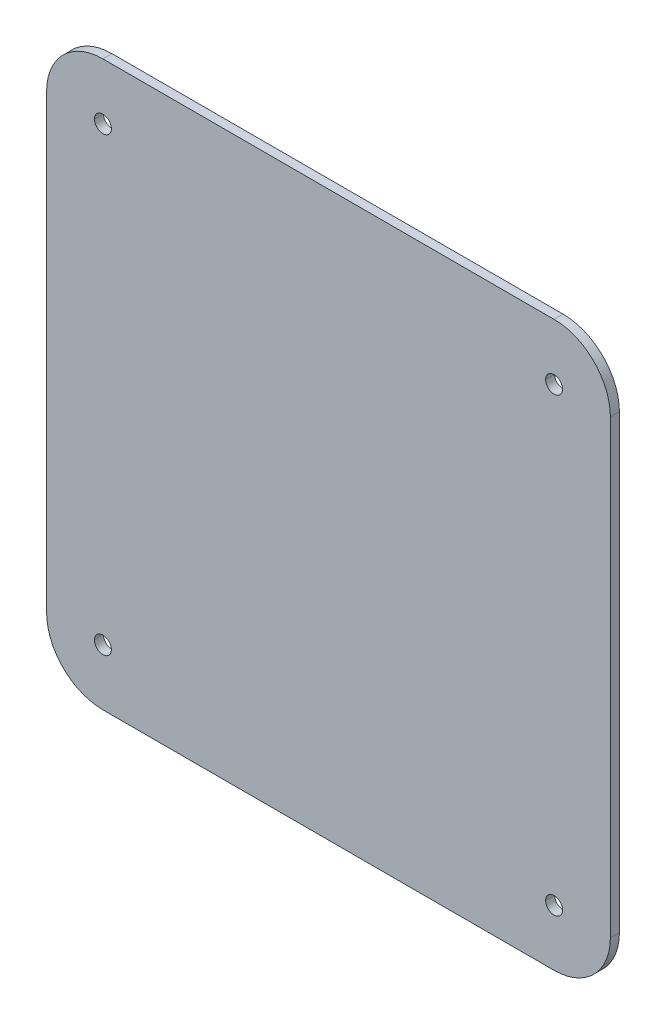
ISO-10303-21;
HEADER;
FILE_DESCRIPTION(('STEP AP214'),'2;1');
FILE_NAME('part.step','',(''),(''),'','','');
FILE_SCHEMA(('AUTOMOTIVE_DESIGN { 1 0 10303 214 1 1 1 1 }'));
ENDSEC;
DATA;
#1=APPLICATION_CONTEXT('core data for automotive mechanical design processes');
#2=APPLICATION_PROTOCOL_DEFINITION('international standard','automotive_design',2000,#1);
#3=PRODUCT_CONTEXT('',#1,'mechanical');
#4=PRODUCT('Part','Part','',(#3));
#5=PRODUCT_RELATED_PRODUCT_CATEGORY('part','',(#4));
#6=PRODUCT_DEFINITION_FORMATION('','',#4);
#7=PRODUCT_DEFINITION_CONTEXT('part definition',#1,'design');
#8=PRODUCT_DEFINITION('design','',#6,#7);
#9=PRODUCT_DEFINITION_SHAPE('','',#8);
#10=(LENGTH_UNIT() NAMED_UNIT(*) SI_UNIT(.MILLI.,.METRE.));
#11=(NAMED_UNIT(*) PLANE_ANGLE_UNIT() SI_UNIT($,.RADIAN.));
#12=(NAMED_UNIT(*) SI_UNIT($,.STERADIAN.) SOLID_ANGLE_UNIT());
#13=UNCERTAINTY_MEASURE_WITH_UNIT(LENGTH_MEASURE(1.E-05),#10,'distance_accuracy_value','');
#14=(GEOMETRIC_REPRESENTATION_CONTEXT(3) GLOBAL_UNCERTAINTY_ASSIGNED_CONTEXT((#13)) GLOBAL_UNIT_ASSIGNED_CONTEXT((#10,
#11,#12)) REPRESENTATION_CONTEXT('',''));
#15=CARTESIAN_POINT('',(0.,0.,0.));
#16=DIRECTION('',(0.,0.,1.));
#17=DIRECTION('',(1.,0.,0.));
#18=AXIS2_PLACEMENT_3D('',#15,#16,#17);
#19=CARTESIAN_POINT('',(11.430022860046,11.694183388367,0.));
#20=DIRECTION('',(0.,0.,-1.));
#21=DIRECTION('',(0.,-1.,0.));
#22=AXIS2_PLACEMENT_3D('',#19,#20,#21);
#23=CYLINDRICAL_SURFACE('',#22,9.9872999746);
#24=DIRECTION('',(0.,0.,1.));
#25=VECTOR('',#24,1.);
#26=CARTESIAN_POINT('',(11.430022860046,1.706883413767,0.));
#27=LINE('',#26,#25);
#28=CARTESIAN_POINT('',(11.430022860046,1.706883413767,0.));
#29=VERTEX_POINT('',#28);
#30=CARTESIAN_POINT('',(11.430022860046,1.706883413767,1.600050800102));
#31=VERTEX_POINT('',#30);
#32=EDGE_CURVE('E9',#29,#31,#27,.T.);
#33=ORIENTED_EDGE('',*,*,#32,.T.);
#34=CARTESIAN_POINT('',(11.430022860046,11.694183388367,1.600050800102));
#35=DIRECTION('',(0.,0.,-1.));
#36=DIRECTION('',(0.,-1.,0.));
#37=AXIS2_PLACEMENT_3D('',#34,#35,#36);
#38=CIRCLE('',#37,9.9872999746);
#39=CARTESIAN_POINT('',(1.442722885446,11.694183388367,1.600050800102));
#40=VERTEX_POINT('',#39);
#41=EDGE_CURVE('E194',#31,#40,#38,.T.);
#42=ORIENTED_EDGE('',*,*,#41,.T.);
#43=DIRECTION('',(0.,0.,1.));
#44=VECTOR('',#43,1.);
#45=CARTESIAN_POINT('',(1.442722885446,11.694183388367,0.));
#46=LINE('',#45,#44);
#47=CARTESIAN_POINT('',(1.442722885446,11.694183388367,0.));
#48=VERTEX_POINT('',#47);
#49=EDGE_CURVE('E18',#48,#40,#46,.T.);
#50=ORIENTED_EDGE('',*,*,#49,.F.);
#51=CARTESIAN_POINT('',(11.430022860046,11.694183388367,0.));
#52=DIRECTION('',(0.,0.,-1.));
#53=DIRECTION('',(0.,-1.,0.));
#54=AXIS2_PLACEMENT_3D('',#51,#52,#53);
#55=CIRCLE('',#54,9.9872999746);
#56=EDGE_CURVE('E204',#29,#48,#55,.T.);
#57=ORIENTED_EDGE('',*,*,#56,.F.);
#58=EDGE_LOOP('',(#33,#42,#50,#57));
#59=FACE_BOUND('',#58,.T.);
#60=ADVANCED_FACE('F14',(#59),#23,.T.);
#61=CARTESIAN_POINT('',(91.430022860046,1.706883413767,0.));
#62=DIRECTION('',(0.,-1.,0.));
#63=DIRECTION('',(0.,0.,-1.));
#64=AXIS2_PLACEMENT_3D('',#61,#62,#63);
#65=PLANE('',#64);
#66=DIRECTION('',(0.,0.,1.));
#67=VECTOR('',#66,1.);
#68=CARTESIAN_POINT('',(91.430022860046,1.706883413767,0.));
#69=LINE('',#68,#67);
#70=CARTESIAN_POINT('',(91.430022860046,1.706883413767,0.));
#71=VERTEX_POINT('',#70);
#72=CARTESIAN_POINT('',(91.430022860046,1.706883413767,1.600050800102));
#73=VERTEX_POINT('',#72);
#74=EDGE_CURVE('E205',#71,#73,#69,.T.);
#75=ORIENTED_EDGE('',*,*,#74,.T.);
#76=DIRECTION('',(-1.,0.,0.));
#77=VECTOR('',#76,1.);
#78=CARTESIAN_POINT('',(91.430022860046,1.706883413767,1.600050800102));
#79=LINE('',#78,#77);
#80=EDGE_CURVE('E195',#73,#31,#79,.T.);
#81=ORIENTED_EDGE('',*,*,#80,.T.);
#82=ORIENTED_EDGE('',*,*,#32,.F.);
#83=DIRECTION('',(-1.,0.,0.));
#84=VECTOR('',#83,1.);
#85=CARTESIAN_POINT('',(91.430022860046,1.706883413767,0.));
#86=LINE('',#85,#84);
#87=EDGE_CURVE('E223',#71,#29,#86,.T.);
#88=ORIENTED_EDGE('',*,*,#87,.F.);
#89=EDGE_LOOP('',(#75,#81,#82,#88));
#90=FACE_BOUND('',#89,.T.);
#91=ADVANCED_FACE('F515',(#90),#65,.T.);
#92=CARTESIAN_POINT('',(1.442722885446,11.694183388367,0.));
#93=DIRECTION('',(-1.,0.,0.));
#94=DIRECTION('',(0.,1.,0.));
#95=AXIS2_PLACEMENT_3D('',#92,#93,#94);
#96=PLANE('',#95);
#97=ORIENTED_EDGE('',*,*,#49,.T.);
#98=DIRECTION('',(0.,1.,0.));
#99=VECTOR('',#98,1.);
#100=CARTESIAN_POINT('',(1.442722885446,11.694183388367,1.600050800102));
#101=LINE('',#100,#99);
#102=CARTESIAN_POINT('',(1.442722885446,91.694183388367,1.600050800102));
#103=VERTEX_POINT('',#102);
#104=EDGE_CURVE('E191',#40,#103,#101,.T.);
#105=ORIENTED_EDGE('',*,*,#104,.T.);
#106=DIRECTION('',(0.,0.,1.));
#107=VECTOR('',#106,1.);
#108=CARTESIAN_POINT('',(1.442722885446,91.694183388367,0.));
#109=LINE('',#108,#107);
#110=CARTESIAN_POINT('',(1.442722885446,91.694183388367,0.));
#111=VERTEX_POINT('',#110);
#112=EDGE_CURVE('E245',#111,#103,#109,.T.);
#113=ORIENTED_EDGE('',*,*,#112,.F.);
#114=DIRECTION('',(0.,1.,0.));
#115=VECTOR('',#114,1.);
#116=CARTESIAN_POINT('',(1.442722885446,11.694183388367,0.));
#117=LINE('',#116,#115);
#118=EDGE_CURVE('E221',#48,#111,#117,.T.);
#119=ORIENTED_EDGE('',*,*,#118,.F.);
#120=EDGE_LOOP('',(#97,#105,#113,#119));
#121=FACE_BOUND('',#120,.T.);
#122=ADVANCED_FACE('F316',(#121),#96,.T.);
#123=CARTESIAN_POINT('',(51.430022860046,51.694183388367,0.));
#124=DIRECTION('',(0.,0.,-1.));
#125=DIRECTION('',(0.,-1.,0.));
#126=AXIS2_PLACEMENT_3D('',#123,#124,#125);
#127=PLANE('',#126);
#128=CARTESIAN_POINT('',(91.430022860046,11.694183388367,0.));
#129=DIRECTION('',(0.,0.,1.));
#130=DIRECTION('',(1.,0.,0.));
#131=AXIS2_PLACEMENT_3D('',#128,#129,#130);
#132=CIRCLE('',#131,1.5);
#133=CARTESIAN_POINT('',(92.930022860046,11.694183388367,0.));
#134=VERTEX_POINT('',#133);
#135=CARTESIAN_POINT('',(89.930022860046,11.694183388367,0.));
#136=VERTEX_POINT('',#135);
#137=EDGE_CURVE('E214',#134,#136,#132,.T.);
#138=ORIENTED_EDGE('',*,*,#137,.T.);
#139=CARTESIAN_POINT('',(91.430022860046,11.694183388367,0.));
#140=DIRECTION('',(0.,0.,1.));
#141=DIRECTION('',(1.,0.,0.));
#142=AXIS2_PLACEMENT_3D('',#139,#140,#141);
#143=CIRCLE('',#142,1.5);
#144=EDGE_CURVE('E237',#136,#134,#143,.T.);
#145=ORIENTED_EDGE('',*,*,#144,.T.);
#146=EDGE_LOOP('',(#138,#145));
#147=FACE_BOUND('',#146,.T.);
#148=CARTESIAN_POINT('',(11.430022860046,11.694183388367,0.));
#149=DIRECTION('',(0.,0.,1.));
#150=DIRECTION('',(1.,0.,0.));
#151=AXIS2_PLACEMENT_3D('',#148,#149,#150);
#152=CIRCLE('',#151,1.5);
#153=CARTESIAN_POINT('',(12.930022860046,11.694183388367,0.));
#154=VERTEX_POINT('',#153);
#155=CARTESIAN_POINT('',(9.930022860046,11.694183388367,0.));
#156=VERTEX_POINT('',#155);
#157=EDGE_CURVE('E190',#154,#156,#152,.T.);
#158=ORIENTED_EDGE('',*,*,#157,.T.);
#159=CARTESIAN_POINT('',(11.430022860046,11.694183388367,0.));
#160=DIRECTION('',(0.,0.,1.));
#161=DIRECTION('',(1.,0.,0.));
#162=AXIS2_PLACEMENT_3D('',#159,#160,#161);
#163=CIRCLE('',#162,1.5);
#164=EDGE_CURVE('E196',#156,#154,#163,.T.);
#165=ORIENTED_EDGE('',*,*,#164,.T.);
#166=EDGE_LOOP('',(#158,#165));
#167=FACE_BOUND('',#166,.T.);
#168=CARTESIAN_POINT('',(91.430022860046,91.694183388367,0.));
#169=DIRECTION('',(0.,0.,1.));
#170=DIRECTION('',(1.,0.,0.));
#171=AXIS2_PLACEMENT_3D('',#168,#169,#170);
#172=CIRCLE('',#171,1.5);
#173=CARTESIAN_POINT('',(92.930022860046,91.694183388367,0.));
#174=VERTEX_POINT('',#173);
#175=CARTESIAN_POINT('',(89.930022860046,91.694183388367,0.));
#176=VERTEX_POINT('',#175);
#177=EDGE_CURVE('E149',#174,#176,#172,.T.);
#178=ORIENTED_EDGE('',*,*,#177,.T.);
#179=CARTESIAN_POINT('',(91.430022860046,91.694183388367,0.));
#180=DIRECTION('',(0.,0.,1.));
#181=DIRECTION('',(1.,0.,0.));
#182=AXIS2_PLACEMENT_3D('',#179,#180,#181);
#183=CIRCLE('',#182,1.5);
#184=EDGE_CURVE('E154',#176,#174,#183,.T.);
#185=ORIENTED_EDGE('',*,*,#184,.T.);
#186=EDGE_LOOP('',(#178,#185));
#187=FACE_BOUND('',#186,.T.);
#188=CARTESIAN_POINT('',(11.430022860046,91.694183388367,0.));
#189=DIRECTION('',(0.,0.,1.));
#190=DIRECTION('',(1.,0.,0.));
#191=AXIS2_PLACEMENT_3D('',#188,#189,#190);
#192=CIRCLE('',#191,1.5);
#193=CARTESIAN_POINT('',(12.930022860046,91.694183388367,0.));
#194=VERTEX_POINT('',#193);
#195=CARTESIAN_POINT('',(9.930022860046,91.694183388367,0.));
#196=VERTEX_POINT('',#195);
#197=EDGE_CURVE('E231',#194,#196,#192,.T.);
#198=ORIENTED_EDGE('',*,*,#197,.T.);
#199=CARTESIAN_POINT('',(11.430022860046,91.694183388367,0.));
#200=DIRECTION('',(0.,0.,1.));
#201=DIRECTION('',(1.,0.,0.));
#202=AXIS2_PLACEMENT_3D('',#199,#200,#201);
#203=CIRCLE('',#202,1.5);
#204=EDGE_CURVE('E272',#196,#194,#203,.T.);
#205=ORIENTED_EDGE('',*,*,#204,.T.);
#206=EDGE_LOOP('',(#198,#205));
#207=FACE_BOUND('',#206,.T.);
#208=ORIENTED_EDGE('',*,*,#56,.T.);
#209=ORIENTED_EDGE('',*,*,#118,.T.);
#210=CARTESIAN_POINT('',(11.430022860046,91.694183388367,0.));
#211=DIRECTION('',(0.,0.,-1.));
#212=DIRECTION('',(-1.,0.,0.));
#213=AXIS2_PLACEMENT_3D('',#210,#211,#212);
#214=CIRCLE('',#213,9.9872999746);
#215=CARTESIAN_POINT('',(11.430022860046,101.68148336296,0.));
#216=VERTEX_POINT('',#215);
#217=EDGE_CURVE('E265',#111,#216,#214,.T.);
#218=ORIENTED_EDGE('',*,*,#217,.T.);
#219=DIRECTION('',(1.,0.,0.));
#220=VECTOR('',#219,1.);
#221=CARTESIAN_POINT('',(11.430022860046,101.68148336296,0.));
#222=LINE('',#221,#220);
#223=CARTESIAN_POINT('',(91.430022860046,101.68148336296,0.));
#224=VERTEX_POINT('',#223);
#225=EDGE_CURVE('E251',#216,#224,#222,.T.);
#226=ORIENTED_EDGE('',*,*,#225,.T.);
#227=CARTESIAN_POINT('',(91.430022860046,91.694183388367,0.));
#228=DIRECTION('',(0.,0.,-1.));
#229=DIRECTION('',(0.,1.,0.));
#230=AXIS2_PLACEMENT_3D('',#227,#228,#229);
#231=CIRCLE('',#230,9.9872999746);
#232=CARTESIAN_POINT('',(101.41732283464,91.694183388367,0.));
#233=VERTEX_POINT('',#232);
#234=EDGE_CURVE('E250',#224,#233,#231,.T.);
#235=ORIENTED_EDGE('',*,*,#234,.T.);
#236=DIRECTION('',(0.,-1.,0.));
#237=VECTOR('',#236,1.);
#238=CARTESIAN_POINT('',(101.41732283464,91.694183388367,0.));
#239=LINE('',#238,#237);
#240=CARTESIAN_POINT('',(101.41732283464,11.694183388367,0.));
#241=VERTEX_POINT('',#240);
#242=EDGE_CURVE('E241',#233,#241,#239,.T.);
#243=ORIENTED_EDGE('',*,*,#242,.T.);
#244=CARTESIAN_POINT('',(91.430022860046,11.694183388367,0.));
#245=DIRECTION('',(0.,0.,-1.));
#246=DIRECTION('',(1.,0.,0.));
#247=AXIS2_PLACEMENT_3D('',#244,#245,#246);
#248=CIRCLE('',#247,9.9872999746);
#249=EDGE_CURVE('E209',#241,#71,#248,.T.);
#250=ORIENTED_EDGE('',*,*,#249,.T.);
#251=ORIENTED_EDGE('',*,*,#87,.T.);
#252=EDGE_LOOP('',(#208,#209,#218,#226,#235,#243,#250,#251));
#253=FACE_BOUND('',#252,.T.);
#254=ADVANCED_FACE('F151',(#147,#167,#187,#207,#253),#127,.T.);
#255=CARTESIAN_POINT('',(51.430022860046,51.694183388367,1.600050800102));
#256=DIRECTION('',(0.,0.,-1.));
#257=DIRECTION('',(0.,-1.,0.));
#258=AXIS2_PLACEMENT_3D('',#255,#256,#257);
#259=PLANE('',#258);
#260=CARTESIAN_POINT('',(91.430022860046,11.694183388367,1.600050800102));
#261=DIRECTION('',(0.,0.,1.));
#262=DIRECTION('',(1.,0.,0.));
#263=AXIS2_PLACEMENT_3D('',#260,#261,#262);
#264=CIRCLE('',#263,1.5);
#265=CARTESIAN_POINT('',(92.930022860046,11.694183388367,1.600050800102));
#266=VERTEX_POINT('',#265);
#267=CARTESIAN_POINT('',(89.930022860046,11.694183388367,1.600050800102));
#268=VERTEX_POINT('',#267);
#269=EDGE_CURVE('E258',#266,#268,#264,.T.);
#270=ORIENTED_EDGE('',*,*,#269,.F.);
#271=CARTESIAN_POINT('',(91.430022860046,11.694183388367,1.600050800102));
#272=DIRECTION('',(0.,0.,1.));
#273=DIRECTION('',(1.,0.,0.));
#274=AXIS2_PLACEMENT_3D('',#271,#272,#273);
#275=CIRCLE('',#274,1.5);
#276=EDGE_CURVE('E187',#268,#266,#275,.T.);
#277=ORIENTED_EDGE('',*,*,#276,.F.);
#278=EDGE_LOOP('',(#270,#277));
#279=FACE_BOUND('',#278,.T.);
#280=CARTESIAN_POINT('',(11.430022860046,11.694183388367,1.600050800102));
#281=DIRECTION('',(0.,0.,1.));
#282=DIRECTION('',(1.,0.,0.));
#283=AXIS2_PLACEMENT_3D('',#280,#281,#282);
#284=CIRCLE('',#283,1.5);
#285=CARTESIAN_POINT('',(12.930022860046,11.694183388367,1.600050800102));
#286=VERTEX_POINT('',#285);
#287=CARTESIAN_POINT('',(9.930022860046,11.694183388367,1.600050800102));
#288=VERTEX_POINT('',#287);
#289=EDGE_CURVE('E211',#286,#288,#284,.T.);
#290=ORIENTED_EDGE('',*,*,#289,.F.);
#291=CARTESIAN_POINT('',(11.430022860046,11.694183388367,1.600050800102));
#292=DIRECTION('',(0.,0.,1.));
#293=DIRECTION('',(1.,0.,0.));
#294=AXIS2_PLACEMENT_3D('',#291,#292,#293);
#295=CIRCLE('',#294,1.5);
#296=EDGE_CURVE('E183',#288,#286,#295,.T.);
#297=ORIENTED_EDGE('',*,*,#296,.F.);
#298=EDGE_LOOP('',(#290,#297));
#299=FACE_BOUND('',#298,.T.);
#300=CARTESIAN_POINT('',(91.430022860046,91.694183388367,1.600050800102));
#301=DIRECTION('',(0.,0.,1.));
#302=DIRECTION('',(1.,0.,0.));
#303=AXIS2_PLACEMENT_3D('',#300,#301,#302);
#304=CIRCLE('',#303,1.5);
#305=CARTESIAN_POINT('',(92.930022860046,91.694183388367,1.600050800102));
#306=VERTEX_POINT('',#305);
#307=CARTESIAN_POINT('',(89.930022860046,91.694183388367,1.600050800102));
#308=VERTEX_POINT('',#307);
#309=EDGE_CURVE('E159',#306,#308,#304,.T.);
#310=ORIENTED_EDGE('',*,*,#309,.F.);
#311=CARTESIAN_POINT('',(91.430022860046,91.694183388367,1.600050800102));
#312=DIRECTION('',(0.,0.,1.));
#313=DIRECTION('',(1.,0.,0.));
#314=AXIS2_PLACEMENT_3D('',#311,#312,#313);
#315=CIRCLE('',#314,1.5);
#316=EDGE_CURVE('E170',#308,#306,#315,.T.);
#317=ORIENTED_EDGE('',*,*,#316,.F.);
#318=EDGE_LOOP('',(#310,#317));
#319=FACE_BOUND('',#318,.T.);
#320=CARTESIAN_POINT('',(11.430022860046,91.694183388367,1.600050800102));
#321=DIRECTION('',(0.,0.,1.));
#322=DIRECTION('',(1.,0.,0.));
#323=AXIS2_PLACEMENT_3D('',#320,#321,#322);
#324=CIRCLE('',#323,1.5);
#325=CARTESIAN_POINT('',(12.930022860046,91.694183388367,1.600050800102));
#326=VERTEX_POINT('',#325);
#327=CARTESIAN_POINT('',(9.930022860046,91.694183388367,1.600050800102));
#328=VERTEX_POINT('',#327);
#329=EDGE_CURVE('E160',#326,#328,#324,.T.);
#330=ORIENTED_EDGE('',*,*,#329,.F.);
#331=CARTESIAN_POINT('',(11.430022860046,91.694183388367,1.600050800102));
#332=DIRECTION('',(0.,0.,1.));
#333=DIRECTION('',(1.,0.,0.));
#334=AXIS2_PLACEMENT_3D('',#331,#332,#333);
#335=CIRCLE('',#334,1.5);
#336=EDGE_CURVE('E232',#328,#326,#335,.T.);
#337=ORIENTED_EDGE('',*,*,#336,.F.);
#338=EDGE_LOOP('',(#330,#337));
#339=FACE_BOUND('',#338,.T.);
#340=ORIENTED_EDGE('',*,*,#80,.F.);
#341=CARTESIAN_POINT('',(91.430022860046,11.694183388367,1.600050800102));
#342=DIRECTION('',(0.,0.,-1.));
#343=DIRECTION('',(1.,0.,0.));
#344=AXIS2_PLACEMENT_3D('',#341,#342,#343);
#345=CIRCLE('',#344,9.9872999746);
#346=CARTESIAN_POINT('',(101.41732283464,11.694183388367,1.600050800102));
#347=VERTEX_POINT('',#346);
#348=EDGE_CURVE('E210',#347,#73,#345,.T.);
#349=ORIENTED_EDGE('',*,*,#348,.F.);
#350=DIRECTION('',(0.,-1.,0.));
#351=VECTOR('',#350,1.);
#352=CARTESIAN_POINT('',(101.41732283464,91.694183388367,1.600050800102));
#353=LINE('',#352,#351);
#354=CARTESIAN_POINT('',(101.41732283464,91.694183388367,1.600050800102));
#355=VERTEX_POINT('',#354);
#356=EDGE_CURVE('E254',#355,#347,#353,.T.);
#357=ORIENTED_EDGE('',*,*,#356,.F.);
#358=CARTESIAN_POINT('',(91.430022860046,91.694183388367,1.600050800102));
#359=DIRECTION('',(0.,0.,-1.));
#360=DIRECTION('',(0.,1.,0.));
#361=AXIS2_PLACEMENT_3D('',#358,#359,#360);
#362=CIRCLE('',#361,9.9872999746);
#363=CARTESIAN_POINT('',(91.430022860046,101.68148336296,1.600050800102));
#364=VERTEX_POINT('',#363);
#365=EDGE_CURVE('E215',#364,#355,#362,.T.);
#366=ORIENTED_EDGE('',*,*,#365,.F.);
#367=DIRECTION('',(1.,0.,0.));
#368=VECTOR('',#367,1.);
#369=CARTESIAN_POINT('',(11.430022860046,101.68148336296,1.600050800102));
#370=LINE('',#369,#368);
#371=CARTESIAN_POINT('',(11.430022860046,101.68148336296,1.600050800102));
#372=VERTEX_POINT('',#371);
#373=EDGE_CURVE('E255',#372,#364,#370,.T.);
#374=ORIENTED_EDGE('',*,*,#373,.F.);
#375=CARTESIAN_POINT('',(11.430022860046,91.694183388367,1.600050800102));
#376=DIRECTION('',(0.,0.,-1.));
#377=DIRECTION('',(-1.,0.,0.));
#378=AXIS2_PLACEMENT_3D('',#375,#376,#377);
#379=CIRCLE('',#378,9.9872999746);
#380=EDGE_CURVE('E262',#103,#372,#379,.T.);
#381=ORIENTED_EDGE('',*,*,#380,.F.);
#382=ORIENTED_EDGE('',*,*,#104,.F.);
#383=ORIENTED_EDGE('',*,*,#41,.F.);
#384=EDGE_LOOP('',(#340,#349,#357,#366,#374,#381,#382,#383));
#385=FACE_BOUND('',#384,.T.);
#386=ADVANCED_FACE('F324',(#279,#299,#319,#339,#385),#259,.F.);
#387=CARTESIAN_POINT('',(91.430022860046,11.694183388367,0.));
#388=DIRECTION('',(0.,0.,-1.));
#389=DIRECTION('',(1.,0.,0.));
#390=AXIS2_PLACEMENT_3D('',#387,#388,#389);
#391=CYLINDRICAL_SURFACE('',#390,9.9872999746);
#392=DIRECTION('',(0.,0.,1.));
#393=VECTOR('',#392,1.);
#394=CARTESIAN_POINT('',(101.41732283464,11.694183388367,0.));
#395=LINE('',#394,#393);
#396=EDGE_CURVE('E246',#241,#347,#395,.T.);
#397=ORIENTED_EDGE('',*,*,#396,.T.);
#398=ORIENTED_EDGE('',*,*,#348,.T.);
#399=ORIENTED_EDGE('',*,*,#74,.F.);
#400=ORIENTED_EDGE('',*,*,#249,.F.);
#401=EDGE_LOOP('',(#397,#398,#399,#400));
#402=FACE_BOUND('',#401,.T.);
#403=ADVANCED_FACE('F528',(#402),#391,.T.);
#404=CARTESIAN_POINT('',(11.430022860046,91.694183388367,0.));
#405=DIRECTION('',(0.,0.,-1.));
#406=DIRECTION('',(-1.,0.,0.));
#407=AXIS2_PLACEMENT_3D('',#404,#405,#406);
#408=CYLINDRICAL_SURFACE('',#407,9.9872999746);
#409=ORIENTED_EDGE('',*,*,#112,.T.);
#410=ORIENTED_EDGE('',*,*,#380,.T.);
#411=DIRECTION('',(0.,0.,1.));
#412=VECTOR('',#411,1.);
#413=CARTESIAN_POINT('',(11.430022860046,101.68148336296,0.));
#414=LINE('',#413,#412);
#415=EDGE_CURVE('E271',#216,#372,#414,.T.);
#416=ORIENTED_EDGE('',*,*,#415,.F.);
#417=ORIENTED_EDGE('',*,*,#217,.F.);
#418=EDGE_LOOP('',(#409,#410,#416,#417));
#419=FACE_BOUND('',#418,.T.);
#420=ADVANCED_FACE('F331',(#419),#408,.T.);
#421=CARTESIAN_POINT('',(101.41732283464,91.694183388367,0.));
#422=DIRECTION('',(1.,0.,0.));
#423=DIRECTION('',(0.,1.,0.));
#424=AXIS2_PLACEMENT_3D('',#421,#422,#423);
#425=PLANE('',#424);
#426=DIRECTION('',(0.,0.,1.));
#427=VECTOR('',#426,1.);
#428=CARTESIAN_POINT('',(101.41732283464,91.694183388367,0.));
#429=LINE('',#428,#427);
#430=EDGE_CURVE('E219',#233,#355,#429,.T.);
#431=ORIENTED_EDGE('',*,*,#430,.T.);
#432=ORIENTED_EDGE('',*,*,#356,.T.);
#433=ORIENTED_EDGE('',*,*,#396,.F.);
#434=ORIENTED_EDGE('',*,*,#242,.F.);
#435=EDGE_LOOP('',(#431,#432,#433,#434));
#436=FACE_BOUND('',#435,.T.);
#437=ADVANCED_FACE('F540',(#436),#425,.T.);
#438=CARTESIAN_POINT('',(11.430022860046,101.68148336296,0.));
#439=DIRECTION('',(0.,1.,0.));
#440=DIRECTION('',(1.,0.,0.));
#441=AXIS2_PLACEMENT_3D('',#438,#439,#440);
#442=PLANE('',#441);
#443=ORIENTED_EDGE('',*,*,#415,.T.);
#444=ORIENTED_EDGE('',*,*,#373,.T.);
#445=DIRECTION('',(0.,0.,1.));
#446=VECTOR('',#445,1.);
#447=CARTESIAN_POINT('',(91.430022860046,101.68148336296,0.));
#448=LINE('',#447,#446);
#449=EDGE_CURVE('E220',#224,#364,#448,.T.);
#450=ORIENTED_EDGE('',*,*,#449,.F.);
#451=ORIENTED_EDGE('',*,*,#225,.F.);
#452=EDGE_LOOP('',(#443,#444,#450,#451));
#453=FACE_BOUND('',#452,.T.);
#454=ADVANCED_FACE('F16',(#453),#442,.T.);
#455=CARTESIAN_POINT('',(91.430022860046,91.694183388367,0.));
#456=DIRECTION('',(0.,0.,-1.));
#457=DIRECTION('',(0.,1.,0.));
#458=AXIS2_PLACEMENT_3D('',#455,#456,#457);
#459=CYLINDRICAL_SURFACE('',#458,9.9872999746);
#460=ORIENTED_EDGE('',*,*,#449,.T.);
#461=ORIENTED_EDGE('',*,*,#365,.T.);
#462=ORIENTED_EDGE('',*,*,#430,.F.);
#463=ORIENTED_EDGE('',*,*,#234,.F.);
#464=EDGE_LOOP('',(#460,#461,#462,#463));
#465=FACE_BOUND('',#464,.T.);
#466=ADVANCED_FACE('F353',(#465),#459,.T.);
#467=CARTESIAN_POINT('',(91.430022860046,11.694183388367,0.));
#468=DIRECTION('',(0.,0.,1.));
#469=DIRECTION('',(1.,0.,0.));
#470=AXIS2_PLACEMENT_3D('',#467,#468,#469);
#471=CYLINDRICAL_SURFACE('',#470,1.5);
#472=DIRECTION('',(0.,0.,1.));
#473=VECTOR('',#472,1.);
#474=CARTESIAN_POINT('',(89.930022860046,11.694183388367,0.));
#475=LINE('',#474,#473);
#476=EDGE_CURVE('E233',#136,#268,#475,.T.);
#477=ORIENTED_EDGE('',*,*,#476,.F.);
#478=ORIENTED_EDGE('',*,*,#137,.F.);
#479=DIRECTION('',(0.,0.,1.));
#480=VECTOR('',#479,1.);
#481=CARTESIAN_POINT('',(92.930022860046,11.694183388367,0.));
#482=LINE('',#481,#480);
#483=EDGE_CURVE('E201',#134,#266,#482,.T.);
#484=ORIENTED_EDGE('',*,*,#483,.T.);
#485=ORIENTED_EDGE('',*,*,#269,.T.);
#486=EDGE_LOOP('',(#477,#478,#484,#485));
#487=FACE_BOUND('',#486,.T.);
#488=ADVANCED_FACE('F393',(#487),#471,.F.);
#489=CARTESIAN_POINT('',(11.430022860046,11.694183388367,0.));
#490=DIRECTION('',(0.,0.,1.));
#491=DIRECTION('',(1.,0.,0.));
#492=AXIS2_PLACEMENT_3D('',#489,#490,#491);
#493=CYLINDRICAL_SURFACE('',#492,1.5);
#494=DIRECTION('',(0.,0.,1.));
#495=VECTOR('',#494,1.);
#496=CARTESIAN_POINT('',(9.930022860046,11.694183388367,0.));
#497=LINE('',#496,#495);
#498=EDGE_CURVE('E200',#156,#288,#497,.T.);
#499=ORIENTED_EDGE('',*,*,#498,.F.);
#500=ORIENTED_EDGE('',*,*,#157,.F.);
#501=DIRECTION('',(0.,0.,1.));
#502=VECTOR('',#501,1.);
#503=CARTESIAN_POINT('',(12.930022860046,11.694183388367,0.));
#504=LINE('',#503,#502);
#505=EDGE_CURVE('E175',#154,#286,#504,.T.);
#506=ORIENTED_EDGE('',*,*,#505,.T.);
#507=ORIENTED_EDGE('',*,*,#289,.T.);
#508=EDGE_LOOP('',(#499,#500,#506,#507));
#509=FACE_BOUND('',#508,.T.);
#510=ADVANCED_FACE('F523',(#509),#493,.F.);
#511=CARTESIAN_POINT('',(91.430022860046,91.694183388367,0.));
#512=DIRECTION('',(0.,0.,1.));
#513=DIRECTION('',(1.,0.,0.));
#514=AXIS2_PLACEMENT_3D('',#511,#512,#513);
#515=CYLINDRICAL_SURFACE('',#514,1.5);
#516=DIRECTION('',(0.,0.,1.));
#517=VECTOR('',#516,1.);
#518=CARTESIAN_POINT('',(89.930022860046,91.694183388367,0.));
#519=LINE('',#518,#517);
#520=EDGE_CURVE('E163',#176,#308,#519,.T.);
#521=ORIENTED_EDGE('',*,*,#520,.F.);
#522=ORIENTED_EDGE('',*,*,#177,.F.);
#523=DIRECTION('',(0.,0.,1.));
#524=VECTOR('',#523,1.);
#525=CARTESIAN_POINT('',(92.930022860046,91.694183388367,0.));
#526=LINE('',#525,#524);
#527=EDGE_CURVE('E173',#174,#306,#526,.T.);
#528=ORIENTED_EDGE('',*,*,#527,.T.);
#529=ORIENTED_EDGE('',*,*,#309,.T.);
#530=EDGE_LOOP('',(#521,#522,#528,#529));
#531=FACE_BOUND('',#530,.T.);
#532=ADVANCED_FACE('F164',(#531),#515,.F.);
#533=CARTESIAN_POINT('',(11.430022860046,91.694183388367,0.));
#534=DIRECTION('',(0.,0.,1.));
#535=DIRECTION('',(1.,0.,0.));
#536=AXIS2_PLACEMENT_3D('',#533,#534,#535);
#537=CYLINDRICAL_SURFACE('',#536,1.5);
#538=DIRECTION('',(0.,0.,1.));
#539=VECTOR('',#538,1.);
#540=CARTESIAN_POINT('',(9.930022860046,91.694183388367,0.));
#541=LINE('',#540,#539);
#542=EDGE_CURVE('E275',#196,#328,#541,.T.);
#543=ORIENTED_EDGE('',*,*,#542,.F.);
#544=ORIENTED_EDGE('',*,*,#197,.F.);
#545=DIRECTION('',(0.,0.,1.));
#546=VECTOR('',#545,1.);
#547=CARTESIAN_POINT('',(12.930022860046,91.694183388367,0.));
#548=LINE('',#547,#546);
#549=EDGE_CURVE('E227',#194,#326,#548,.T.);
#550=ORIENTED_EDGE('',*,*,#549,.T.);
#551=ORIENTED_EDGE('',*,*,#329,.T.);
#552=EDGE_LOOP('',(#543,#544,#550,#551));
#553=FACE_BOUND('',#552,.T.);
#554=ADVANCED_FACE('F607',(#553),#537,.F.);
#555=CARTESIAN_POINT('',(11.430022860046,91.694183388367,0.));
#556=DIRECTION('',(0.,0.,1.));
#557=DIRECTION('',(1.,0.,0.));
#558=AXIS2_PLACEMENT_3D('',#555,#556,#557);
#559=CYLINDRICAL_SURFACE('',#558,1.5);
#560=ORIENTED_EDGE('',*,*,#204,.F.);
#561=ORIENTED_EDGE('',*,*,#542,.T.);
#562=ORIENTED_EDGE('',*,*,#336,.T.);
#563=ORIENTED_EDGE('',*,*,#549,.F.);
#564=EDGE_LOOP('',(#560,#561,#562,#563));
#565=FACE_BOUND('',#564,.T.);
#566=ADVANCED_FACE('F577',(#565),#559,.F.);
#567=CARTESIAN_POINT('',(91.430022860046,91.694183388367,0.));
#568=DIRECTION('',(0.,0.,1.));
#569=DIRECTION('',(1.,0.,0.));
#570=AXIS2_PLACEMENT_3D('',#567,#568,#569);
#571=CYLINDRICAL_SURFACE('',#570,1.5);
#572=ORIENTED_EDGE('',*,*,#184,.F.);
#573=ORIENTED_EDGE('',*,*,#520,.T.);
#574=ORIENTED_EDGE('',*,*,#316,.T.);
#575=ORIENTED_EDGE('',*,*,#527,.F.);
#576=EDGE_LOOP('',(#572,#573,#574,#575));
#577=FACE_BOUND('',#576,.T.);
#578=ADVANCED_FACE('F172',(#577),#571,.F.);
#579=CARTESIAN_POINT('',(11.430022860046,11.694183388367,0.));
#580=DIRECTION('',(0.,0.,1.));
#581=DIRECTION('',(1.,0.,0.));
#582=AXIS2_PLACEMENT_3D('',#579,#580,#581);
#583=CYLINDRICAL_SURFACE('',#582,1.5);
#584=ORIENTED_EDGE('',*,*,#164,.F.);
#585=ORIENTED_EDGE('',*,*,#498,.T.);
#586=ORIENTED_EDGE('',*,*,#296,.T.);
#587=ORIENTED_EDGE('',*,*,#505,.F.);
#588=EDGE_LOOP('',(#584,#585,#586,#587));
#589=FACE_BOUND('',#588,.T.);
#590=ADVANCED_FACE('F576',(#589),#583,.F.);
#591=CARTESIAN_POINT('',(91.430022860046,11.694183388367,0.));
#592=DIRECTION('',(0.,0.,1.));
#593=DIRECTION('',(1.,0.,0.));
#594=AXIS2_PLACEMENT_3D('',#591,#592,#593);
#595=CYLINDRICAL_SURFACE('',#594,1.5);
#596=ORIENTED_EDGE('',*,*,#144,.F.);
#597=ORIENTED_EDGE('',*,*,#476,.T.);
#598=ORIENTED_EDGE('',*,*,#276,.T.);
#599=ORIENTED_EDGE('',*,*,#483,.F.);
#600=EDGE_LOOP('',(#596,#597,#598,#599));
#601=FACE_BOUND('',#600,.T.);
#602=ADVANCED_FACE('F389',(#601),#595,.F.);
#603=CLOSED_SHELL('',(#60,#91,#122,#254,#386,#403,#420,#437,#454,#466,#488,#510,#532,#554,#566,
#578,#590,#602));
#604=MANIFOLD_SOLID_BREP('B1',#603);
#605=ADVANCED_BREP_SHAPE_REPRESENTATION('',(#18,#604),#14);
#606=SHAPE_DEFINITION_REPRESENTATION(#9,#605);
ENDSEC;
END-ISO-10303-21;
